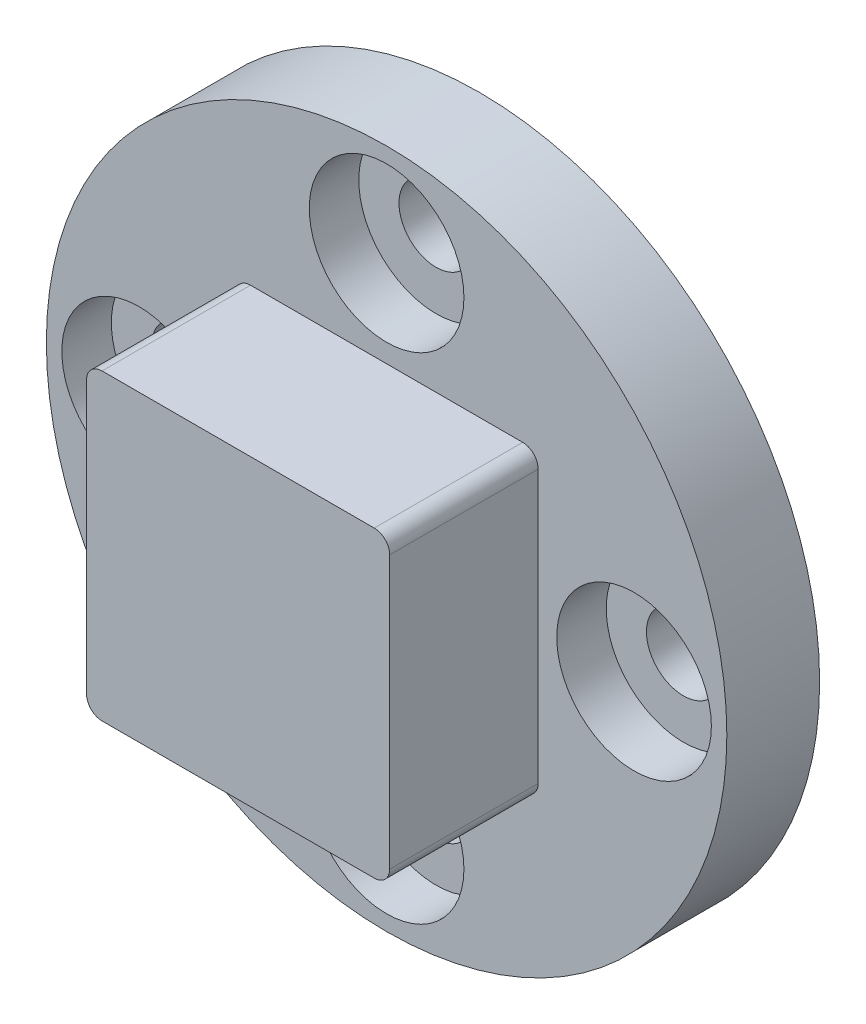
ISO-10303-21;
HEADER;
FILE_DESCRIPTION(('STEP AP214'),'2;1');
FILE_NAME('part.step','',(''),(''),'','','');
FILE_SCHEMA(('AUTOMOTIVE_DESIGN { 1 0 10303 214 1 1 1 1 }'));
ENDSEC;
DATA;
#1=APPLICATION_CONTEXT('core data for automotive mechanical design processes');
#2=APPLICATION_PROTOCOL_DEFINITION('international standard','automotive_design',2000,#1);
#3=PRODUCT_CONTEXT('',#1,'mechanical');
#4=PRODUCT('Part','Part','',(#3));
#5=PRODUCT_RELATED_PRODUCT_CATEGORY('part','',(#4));
#6=PRODUCT_DEFINITION_FORMATION('','',#4);
#7=PRODUCT_DEFINITION_CONTEXT('part definition',#1,'design');
#8=PRODUCT_DEFINITION('design','',#6,#7);
#9=PRODUCT_DEFINITION_SHAPE('','',#8);
#10=(LENGTH_UNIT() NAMED_UNIT(*) SI_UNIT(.MILLI.,.METRE.));
#11=(NAMED_UNIT(*) PLANE_ANGLE_UNIT() SI_UNIT($,.RADIAN.));
#12=(NAMED_UNIT(*) SI_UNIT($,.STERADIAN.) SOLID_ANGLE_UNIT());
#13=UNCERTAINTY_MEASURE_WITH_UNIT(LENGTH_MEASURE(1.E-05),#10,'distance_accuracy_value','');
#14=(GEOMETRIC_REPRESENTATION_CONTEXT(3) GLOBAL_UNCERTAINTY_ASSIGNED_CONTEXT((#13)) GLOBAL_UNIT_ASSIGNED_CONTEXT((#10,
#11,#12)) REPRESENTATION_CONTEXT('',''));
#15=CARTESIAN_POINT('',(0.,0.,0.));
#16=DIRECTION('',(0.,0.,1.));
#17=DIRECTION('',(1.,0.,0.));
#18=AXIS2_PLACEMENT_3D('',#15,#16,#17);
#19=CARTESIAN_POINT('',(0.,0.,3.));
#20=DIRECTION('',(0.,0.,1.));
#21=DIRECTION('',(1.,0.,0.));
#22=AXIS2_PLACEMENT_3D('',#19,#20,#21);
#23=PLANE('',#22);
#24=CARTESIAN_POINT('',(0.,8.,3.));
#25=DIRECTION('',(0.,0.,1.));
#26=DIRECTION('',(1.,0.,0.));
#27=AXIS2_PLACEMENT_3D('',#24,#25,#26);
#28=CIRCLE('',#27,2.5);
#29=CARTESIAN_POINT('',(2.5,8.,3.));
#30=VERTEX_POINT('',#29);
#31=EDGE_CURVE('E134',#30,#30,#28,.T.);
#32=ORIENTED_EDGE('',*,*,#31,.F.);
#33=EDGE_LOOP('',(#32));
#34=FACE_BOUND('',#33,.T.);
#35=CARTESIAN_POINT('',(8.,0.,3.));
#36=DIRECTION('',(0.,0.,1.));
#37=DIRECTION('',(1.,0.,0.));
#38=AXIS2_PLACEMENT_3D('',#35,#36,#37);
#39=CIRCLE('',#38,2.5);
#40=CARTESIAN_POINT('',(10.5,0.,3.));
#41=VERTEX_POINT('',#40);
#42=EDGE_CURVE('E147',#41,#41,#39,.T.);
#43=ORIENTED_EDGE('',*,*,#42,.F.);
#44=EDGE_LOOP('',(#43));
#45=FACE_BOUND('',#44,.T.);
#46=CARTESIAN_POINT('',(0.,-8.,3.));
#47=DIRECTION('',(0.,0.,1.));
#48=DIRECTION('',(1.,0.,0.));
#49=AXIS2_PLACEMENT_3D('',#46,#47,#48);
#50=CIRCLE('',#49,2.5);
#51=CARTESIAN_POINT('',(2.5,-8.,3.));
#52=VERTEX_POINT('',#51);
#53=EDGE_CURVE('E159',#52,#52,#50,.T.);
#54=ORIENTED_EDGE('',*,*,#53,.F.);
#55=EDGE_LOOP('',(#54));
#56=FACE_BOUND('',#55,.T.);
#57=CARTESIAN_POINT('',(-8.,0.,3.));
#58=DIRECTION('',(0.,0.,1.));
#59=DIRECTION('',(1.,0.,0.));
#60=AXIS2_PLACEMENT_3D('',#57,#58,#59);
#61=CIRCLE('',#60,2.5);
#62=CARTESIAN_POINT('',(-5.50000000000001,0.,3.));
#63=VERTEX_POINT('',#62);
#64=EDGE_CURVE('E171',#63,#63,#61,.T.);
#65=ORIENTED_EDGE('',*,*,#64,.F.);
#66=EDGE_LOOP('',(#65));
#67=FACE_BOUND('',#66,.T.);
#68=CARTESIAN_POINT('',(0.,0.,3.));
#69=DIRECTION('',(0.,0.,1.));
#70=DIRECTION('',(1.,0.,0.));
#71=AXIS2_PLACEMENT_3D('',#68,#69,#70);
#72=CIRCLE('',#71,11.);
#73=CARTESIAN_POINT('',(11.,0.,3.));
#74=VERTEX_POINT('',#73);
#75=EDGE_CURVE('E184',#74,#74,#72,.T.);
#76=ORIENTED_EDGE('',*,*,#75,.T.);
#77=EDGE_LOOP('',(#76));
#78=FACE_BOUND('',#77,.T.);
#79=DIRECTION('',(-1.,0.,0.));
#80=VECTOR('',#79,1.);
#81=CARTESIAN_POINT('',(-4.9,4.9,3.));
#82=LINE('',#81,#80);
#83=CARTESIAN_POINT('',(4.4,4.9,3.));
#84=VERTEX_POINT('',#83);
#85=CARTESIAN_POINT('',(-4.4,4.9,3.));
#86=VERTEX_POINT('',#85);
#87=EDGE_CURVE('E126',#84,#86,#82,.T.);
#88=ORIENTED_EDGE('',*,*,#87,.F.);
#89=CARTESIAN_POINT('',(4.4,4.4,3.));
#90=DIRECTION('',(0.,0.,1.));
#91=DIRECTION('',(1.,0.,0.));
#92=AXIS2_PLACEMENT_3D('',#89,#90,#91);
#93=CIRCLE('',#92,0.5);
#94=CARTESIAN_POINT('',(4.9,4.4,3.));
#95=VERTEX_POINT('',#94);
#96=EDGE_CURVE('E112',#84,#95,#93,.F.);
#97=ORIENTED_EDGE('',*,*,#96,.T.);
#98=DIRECTION('',(0.,1.,0.));
#99=VECTOR('',#98,1.);
#100=CARTESIAN_POINT('',(4.9,4.9,3.));
#101=LINE('',#100,#99);
#102=CARTESIAN_POINT('',(4.9,-4.4,3.));
#103=VERTEX_POINT('',#102);
#104=EDGE_CURVE('E130',#103,#95,#101,.T.);
#105=ORIENTED_EDGE('',*,*,#104,.F.);
#106=CARTESIAN_POINT('',(4.4,-4.4,3.));
#107=DIRECTION('',(0.,0.,1.));
#108=DIRECTION('',(1.,0.,0.));
#109=AXIS2_PLACEMENT_3D('',#106,#107,#108);
#110=CIRCLE('',#109,0.5);
#111=CARTESIAN_POINT('',(4.4,-4.9,3.));
#112=VERTEX_POINT('',#111);
#113=EDGE_CURVE('E47',#103,#112,#110,.F.);
#114=ORIENTED_EDGE('',*,*,#113,.T.);
#115=DIRECTION('',(1.,0.,0.));
#116=VECTOR('',#115,1.);
#117=CARTESIAN_POINT('',(-4.9,-4.9,3.));
#118=LINE('',#117,#116);
#119=CARTESIAN_POINT('',(-4.4,-4.9,3.));
#120=VERTEX_POINT('',#119);
#121=EDGE_CURVE('E125',#120,#112,#118,.T.);
#122=ORIENTED_EDGE('',*,*,#121,.F.);
#123=CARTESIAN_POINT('',(-4.4,-4.4,3.));
#124=DIRECTION('',(0.,0.,1.));
#125=DIRECTION('',(1.,0.,0.));
#126=AXIS2_PLACEMENT_3D('',#123,#124,#125);
#127=CIRCLE('',#126,0.5);
#128=CARTESIAN_POINT('',(-4.9,-4.4,3.));
#129=VERTEX_POINT('',#128);
#130=EDGE_CURVE('E11',#120,#129,#127,.F.);
#131=ORIENTED_EDGE('',*,*,#130,.T.);
#132=DIRECTION('',(0.,-1.,0.));
#133=VECTOR('',#132,1.);
#134=CARTESIAN_POINT('',(-4.9,4.9,3.));
#135=LINE('',#134,#133);
#136=CARTESIAN_POINT('',(-4.9,4.4,3.));
#137=VERTEX_POINT('',#136);
#138=EDGE_CURVE('E119',#137,#129,#135,.T.);
#139=ORIENTED_EDGE('',*,*,#138,.F.);
#140=CARTESIAN_POINT('',(-4.4,4.4,3.));
#141=DIRECTION('',(0.,0.,1.));
#142=DIRECTION('',(1.,0.,0.));
#143=AXIS2_PLACEMENT_3D('',#140,#141,#142);
#144=CIRCLE('',#143,0.5);
#145=EDGE_CURVE('E103',#137,#86,#144,.F.);
#146=ORIENTED_EDGE('',*,*,#145,.T.);
#147=EDGE_LOOP('',(#88,#97,#105,#114,#122,#131,#139,#146));
#148=FACE_BOUND('',#147,.T.);
#149=ADVANCED_FACE('F39',(#34,#45,#56,#67,#78,#148),#23,.T.);
#150=CARTESIAN_POINT('',(0.,0.,3.));
#151=DIRECTION('',(0.,0.,-1.));
#152=DIRECTION('',(-1.,0.,0.));
#153=AXIS2_PLACEMENT_3D('',#150,#151,#152);
#154=CYLINDRICAL_SURFACE('',#153,11.);
#155=ORIENTED_EDGE('',*,*,#75,.F.);
#156=EDGE_LOOP('',(#155));
#157=FACE_BOUND('',#156,.T.);
#158=CARTESIAN_POINT('',(0.,0.,0.));
#159=DIRECTION('',(0.,0.,1.));
#160=DIRECTION('',(1.,0.,0.));
#161=AXIS2_PLACEMENT_3D('',#158,#159,#160);
#162=CIRCLE('',#161,11.);
#163=CARTESIAN_POINT('',(11.,0.,0.));
#164=VERTEX_POINT('',#163);
#165=EDGE_CURVE('E183',#164,#164,#162,.T.);
#166=ORIENTED_EDGE('',*,*,#165,.T.);
#167=EDGE_LOOP('',(#166));
#168=FACE_BOUND('',#167,.T.);
#169=ADVANCED_FACE('F245',(#157,#168),#154,.T.);
#170=CARTESIAN_POINT('',(0.,0.,0.));
#171=DIRECTION('',(0.,0.,1.));
#172=DIRECTION('',(1.,0.,0.));
#173=AXIS2_PLACEMENT_3D('',#170,#171,#172);
#174=PLANE('',#173);
#175=CARTESIAN_POINT('',(0.,8.,0.));
#176=DIRECTION('',(0.,0.,1.));
#177=DIRECTION('',(1.,0.,0.));
#178=AXIS2_PLACEMENT_3D('',#175,#176,#177);
#179=CIRCLE('',#178,1.2);
#180=CARTESIAN_POINT('',(1.2,8.,0.));
#181=VERTEX_POINT('',#180);
#182=EDGE_CURVE('E144',#181,#181,#179,.T.);
#183=ORIENTED_EDGE('',*,*,#182,.T.);
#184=EDGE_LOOP('',(#183));
#185=FACE_BOUND('',#184,.T.);
#186=CARTESIAN_POINT('',(8.,0.,0.));
#187=DIRECTION('',(0.,0.,1.));
#188=DIRECTION('',(1.,0.,0.));
#189=AXIS2_PLACEMENT_3D('',#186,#187,#188);
#190=CIRCLE('',#189,1.2);
#191=CARTESIAN_POINT('',(9.2,0.,0.));
#192=VERTEX_POINT('',#191);
#193=EDGE_CURVE('E156',#192,#192,#190,.T.);
#194=ORIENTED_EDGE('',*,*,#193,.T.);
#195=EDGE_LOOP('',(#194));
#196=FACE_BOUND('',#195,.T.);
#197=CARTESIAN_POINT('',(0.,-8.,0.));
#198=DIRECTION('',(0.,0.,1.));
#199=DIRECTION('',(1.,0.,0.));
#200=AXIS2_PLACEMENT_3D('',#197,#198,#199);
#201=CIRCLE('',#200,1.2);
#202=CARTESIAN_POINT('',(1.2,-8.,0.));
#203=VERTEX_POINT('',#202);
#204=EDGE_CURVE('E168',#203,#203,#201,.T.);
#205=ORIENTED_EDGE('',*,*,#204,.T.);
#206=EDGE_LOOP('',(#205));
#207=FACE_BOUND('',#206,.T.);
#208=CARTESIAN_POINT('',(-8.,0.,0.));
#209=DIRECTION('',(0.,0.,1.));
#210=DIRECTION('',(1.,0.,0.));
#211=AXIS2_PLACEMENT_3D('',#208,#209,#210);
#212=CIRCLE('',#211,1.2);
#213=CARTESIAN_POINT('',(-6.8,0.,0.));
#214=VERTEX_POINT('',#213);
#215=EDGE_CURVE('E180',#214,#214,#212,.T.);
#216=ORIENTED_EDGE('',*,*,#215,.T.);
#217=EDGE_LOOP('',(#216));
#218=FACE_BOUND('',#217,.T.);
#219=ORIENTED_EDGE('',*,*,#165,.F.);
#220=EDGE_LOOP('',(#219));
#221=FACE_BOUND('',#220,.T.);
#222=ADVANCED_FACE('F253',(#185,#196,#207,#218,#221),#174,.F.);
#223=CARTESIAN_POINT('',(-8.,0.,3.));
#224=DIRECTION('',(0.,0.,1.));
#225=DIRECTION('',(1.,0.,0.));
#226=AXIS2_PLACEMENT_3D('',#223,#224,#225);
#227=CYLINDRICAL_SURFACE('',#226,1.2);
#228=ORIENTED_EDGE('',*,*,#215,.F.);
#229=EDGE_LOOP('',(#228));
#230=FACE_BOUND('',#229,.T.);
#231=CARTESIAN_POINT('',(-8.,0.,1.4));
#232=DIRECTION('',(0.,0.,1.));
#233=DIRECTION('',(1.,0.,0.));
#234=AXIS2_PLACEMENT_3D('',#231,#232,#233);
#235=CIRCLE('',#234,1.2);
#236=CARTESIAN_POINT('',(-6.8,0.,1.4));
#237=VERTEX_POINT('',#236);
#238=EDGE_CURVE('E177',#237,#237,#235,.T.);
#239=ORIENTED_EDGE('',*,*,#238,.T.);
#240=EDGE_LOOP('',(#239));
#241=FACE_BOUND('',#240,.T.);
#242=ADVANCED_FACE('F260',(#230,#241),#227,.F.);
#243=CARTESIAN_POINT('',(-6.8,0.,1.4));
#244=DIRECTION('',(0.,0.,-1.));
#245=DIRECTION('',(-1.,0.,0.));
#246=AXIS2_PLACEMENT_3D('',#243,#244,#245);
#247=PLANE('',#246);
#248=ORIENTED_EDGE('',*,*,#238,.F.);
#249=EDGE_LOOP('',(#248));
#250=FACE_BOUND('',#249,.T.);
#251=CARTESIAN_POINT('',(-8.,0.,1.4));
#252=DIRECTION('',(0.,0.,1.));
#253=DIRECTION('',(1.,0.,0.));
#254=AXIS2_PLACEMENT_3D('',#251,#252,#253);
#255=CIRCLE('',#254,2.5);
#256=CARTESIAN_POINT('',(-5.5,0.,1.4));
#257=VERTEX_POINT('',#256);
#258=EDGE_CURVE('E174',#257,#257,#255,.T.);
#259=ORIENTED_EDGE('',*,*,#258,.T.);
#260=EDGE_LOOP('',(#259));
#261=FACE_BOUND('',#260,.T.);
#262=ADVANCED_FACE('F414',(#250,#261),#247,.F.);
#263=CARTESIAN_POINT('',(-8.,0.,3.));
#264=DIRECTION('',(0.,0.,1.));
#265=DIRECTION('',(1.,0.,0.));
#266=AXIS2_PLACEMENT_3D('',#263,#264,#265);
#267=CYLINDRICAL_SURFACE('',#266,2.5);
#268=ORIENTED_EDGE('',*,*,#258,.F.);
#269=EDGE_LOOP('',(#268));
#270=FACE_BOUND('',#269,.T.);
#271=ORIENTED_EDGE('',*,*,#64,.T.);
#272=EDGE_LOOP('',(#271));
#273=FACE_BOUND('',#272,.T.);
#274=ADVANCED_FACE('F405',(#270,#273),#267,.F.);
#275=CARTESIAN_POINT('',(0.,-8.,3.));
#276=DIRECTION('',(0.,0.,1.));
#277=DIRECTION('',(1.,0.,0.));
#278=AXIS2_PLACEMENT_3D('',#275,#276,#277);
#279=CYLINDRICAL_SURFACE('',#278,1.2);
#280=ORIENTED_EDGE('',*,*,#204,.F.);
#281=EDGE_LOOP('',(#280));
#282=FACE_BOUND('',#281,.T.);
#283=CARTESIAN_POINT('',(0.,-8.,1.4));
#284=DIRECTION('',(0.,0.,1.));
#285=DIRECTION('',(1.,0.,0.));
#286=AXIS2_PLACEMENT_3D('',#283,#284,#285);
#287=CIRCLE('',#286,1.2);
#288=CARTESIAN_POINT('',(1.2,-8.,1.4));
#289=VERTEX_POINT('',#288);
#290=EDGE_CURVE('E165',#289,#289,#287,.T.);
#291=ORIENTED_EDGE('',*,*,#290,.T.);
#292=EDGE_LOOP('',(#291));
#293=FACE_BOUND('',#292,.T.);
#294=ADVANCED_FACE('F396',(#282,#293),#279,.F.);
#295=CARTESIAN_POINT('',(1.2,-8.,1.4));
#296=DIRECTION('',(0.,0.,-1.));
#297=DIRECTION('',(-1.,0.,0.));
#298=AXIS2_PLACEMENT_3D('',#295,#296,#297);
#299=PLANE('',#298);
#300=ORIENTED_EDGE('',*,*,#290,.F.);
#301=EDGE_LOOP('',(#300));
#302=FACE_BOUND('',#301,.T.);
#303=CARTESIAN_POINT('',(0.,-8.,1.4));
#304=DIRECTION('',(0.,0.,1.));
#305=DIRECTION('',(1.,0.,0.));
#306=AXIS2_PLACEMENT_3D('',#303,#304,#305);
#307=CIRCLE('',#306,2.5);
#308=CARTESIAN_POINT('',(2.5,-8.,1.4));
#309=VERTEX_POINT('',#308);
#310=EDGE_CURVE('E162',#309,#309,#307,.T.);
#311=ORIENTED_EDGE('',*,*,#310,.T.);
#312=EDGE_LOOP('',(#311));
#313=FACE_BOUND('',#312,.T.);
#314=ADVANCED_FACE('F387',(#302,#313),#299,.F.);
#315=CARTESIAN_POINT('',(0.,-8.,3.));
#316=DIRECTION('',(0.,0.,1.));
#317=DIRECTION('',(1.,0.,0.));
#318=AXIS2_PLACEMENT_3D('',#315,#316,#317);
#319=CYLINDRICAL_SURFACE('',#318,2.5);
#320=ORIENTED_EDGE('',*,*,#310,.F.);
#321=EDGE_LOOP('',(#320));
#322=FACE_BOUND('',#321,.T.);
#323=ORIENTED_EDGE('',*,*,#53,.T.);
#324=EDGE_LOOP('',(#323));
#325=FACE_BOUND('',#324,.T.);
#326=ADVANCED_FACE('F378',(#322,#325),#319,.F.);
#327=CARTESIAN_POINT('',(8.,0.,3.));
#328=DIRECTION('',(0.,0.,1.));
#329=DIRECTION('',(1.,0.,0.));
#330=AXIS2_PLACEMENT_3D('',#327,#328,#329);
#331=CYLINDRICAL_SURFACE('',#330,1.2);
#332=ORIENTED_EDGE('',*,*,#193,.F.);
#333=EDGE_LOOP('',(#332));
#334=FACE_BOUND('',#333,.T.);
#335=CARTESIAN_POINT('',(8.,0.,1.4));
#336=DIRECTION('',(0.,0.,1.));
#337=DIRECTION('',(1.,0.,0.));
#338=AXIS2_PLACEMENT_3D('',#335,#336,#337);
#339=CIRCLE('',#338,1.2);
#340=CARTESIAN_POINT('',(9.2,0.,1.4));
#341=VERTEX_POINT('',#340);
#342=EDGE_CURVE('E153',#341,#341,#339,.T.);
#343=ORIENTED_EDGE('',*,*,#342,.T.);
#344=EDGE_LOOP('',(#343));
#345=FACE_BOUND('',#344,.T.);
#346=ADVANCED_FACE('F369',(#334,#345),#331,.F.);
#347=CARTESIAN_POINT('',(9.2,0.,1.4));
#348=DIRECTION('',(0.,0.,-1.));
#349=DIRECTION('',(-1.,0.,0.));
#350=AXIS2_PLACEMENT_3D('',#347,#348,#349);
#351=PLANE('',#350);
#352=ORIENTED_EDGE('',*,*,#342,.F.);
#353=EDGE_LOOP('',(#352));
#354=FACE_BOUND('',#353,.T.);
#355=CARTESIAN_POINT('',(8.,0.,1.4));
#356=DIRECTION('',(0.,0.,1.));
#357=DIRECTION('',(1.,0.,0.));
#358=AXIS2_PLACEMENT_3D('',#355,#356,#357);
#359=CIRCLE('',#358,2.5);
#360=CARTESIAN_POINT('',(10.5,0.,1.4));
#361=VERTEX_POINT('',#360);
#362=EDGE_CURVE('E150',#361,#361,#359,.T.);
#363=ORIENTED_EDGE('',*,*,#362,.T.);
#364=EDGE_LOOP('',(#363));
#365=FACE_BOUND('',#364,.T.);
#366=ADVANCED_FACE('F360',(#354,#365),#351,.F.);
#367=CARTESIAN_POINT('',(8.,0.,3.));
#368=DIRECTION('',(0.,0.,1.));
#369=DIRECTION('',(1.,0.,0.));
#370=AXIS2_PLACEMENT_3D('',#367,#368,#369);
#371=CYLINDRICAL_SURFACE('',#370,2.5);
#372=ORIENTED_EDGE('',*,*,#362,.F.);
#373=EDGE_LOOP('',(#372));
#374=FACE_BOUND('',#373,.T.);
#375=ORIENTED_EDGE('',*,*,#42,.T.);
#376=EDGE_LOOP('',(#375));
#377=FACE_BOUND('',#376,.T.);
#378=ADVANCED_FACE('F351',(#374,#377),#371,.F.);
#379=CARTESIAN_POINT('',(0.,8.,3.));
#380=DIRECTION('',(0.,0.,1.));
#381=DIRECTION('',(1.,0.,0.));
#382=AXIS2_PLACEMENT_3D('',#379,#380,#381);
#383=CYLINDRICAL_SURFACE('',#382,1.2);
#384=ORIENTED_EDGE('',*,*,#182,.F.);
#385=EDGE_LOOP('',(#384));
#386=FACE_BOUND('',#385,.T.);
#387=CARTESIAN_POINT('',(0.,8.,1.4));
#388=DIRECTION('',(0.,0.,1.));
#389=DIRECTION('',(1.,0.,0.));
#390=AXIS2_PLACEMENT_3D('',#387,#388,#389);
#391=CIRCLE('',#390,1.2);
#392=CARTESIAN_POINT('',(1.2,8.,1.4));
#393=VERTEX_POINT('',#392);
#394=EDGE_CURVE('E141',#393,#393,#391,.T.);
#395=ORIENTED_EDGE('',*,*,#394,.T.);
#396=EDGE_LOOP('',(#395));
#397=FACE_BOUND('',#396,.T.);
#398=ADVANCED_FACE('F342',(#386,#397),#383,.F.);
#399=CARTESIAN_POINT('',(1.2,8.,1.4));
#400=DIRECTION('',(0.,0.,-1.));
#401=DIRECTION('',(-1.,0.,0.));
#402=AXIS2_PLACEMENT_3D('',#399,#400,#401);
#403=PLANE('',#402);
#404=ORIENTED_EDGE('',*,*,#394,.F.);
#405=EDGE_LOOP('',(#404));
#406=FACE_BOUND('',#405,.T.);
#407=CARTESIAN_POINT('',(0.,8.,1.4));
#408=DIRECTION('',(0.,0.,1.));
#409=DIRECTION('',(1.,0.,0.));
#410=AXIS2_PLACEMENT_3D('',#407,#408,#409);
#411=CIRCLE('',#410,2.5);
#412=CARTESIAN_POINT('',(2.5,8.,1.4));
#413=VERTEX_POINT('',#412);
#414=EDGE_CURVE('E137',#413,#413,#411,.T.);
#415=ORIENTED_EDGE('',*,*,#414,.T.);
#416=EDGE_LOOP('',(#415));
#417=FACE_BOUND('',#416,.T.);
#418=ADVANCED_FACE('F333',(#406,#417),#403,.F.);
#419=CARTESIAN_POINT('',(0.,8.,3.));
#420=DIRECTION('',(0.,0.,1.));
#421=DIRECTION('',(1.,0.,0.));
#422=AXIS2_PLACEMENT_3D('',#419,#420,#421);
#423=CYLINDRICAL_SURFACE('',#422,2.5);
#424=ORIENTED_EDGE('',*,*,#414,.F.);
#425=EDGE_LOOP('',(#424));
#426=FACE_BOUND('',#425,.T.);
#427=ORIENTED_EDGE('',*,*,#31,.T.);
#428=EDGE_LOOP('',(#427));
#429=FACE_BOUND('',#428,.T.);
#430=ADVANCED_FACE('F321',(#426,#429),#423,.F.);
#431=CARTESIAN_POINT('',(4.9,4.9,7.8));
#432=DIRECTION('',(-1.,0.,0.));
#433=DIRECTION('',(0.,-1.,0.));
#434=AXIS2_PLACEMENT_3D('',#431,#432,#433);
#435=PLANE('',#434);
#436=ORIENTED_EDGE('',*,*,#104,.T.);
#437=DIRECTION('',(0.,0.,-1.));
#438=VECTOR('',#437,1.);
#439=CARTESIAN_POINT('',(4.9,4.4,7.8));
#440=LINE('',#439,#438);
#441=CARTESIAN_POINT('',(4.9,4.4,7.8));
#442=VERTEX_POINT('',#441);
#443=EDGE_CURVE('E204',#95,#442,#440,.F.);
#444=ORIENTED_EDGE('',*,*,#443,.T.);
#445=DIRECTION('',(0.,1.,0.));
#446=VECTOR('',#445,1.);
#447=CARTESIAN_POINT('',(4.9,4.9,7.8));
#448=LINE('',#447,#446);
#449=CARTESIAN_POINT('',(4.9,-4.4,7.8));
#450=VERTEX_POINT('',#449);
#451=EDGE_CURVE('E128',#450,#442,#448,.T.);
#452=ORIENTED_EDGE('',*,*,#451,.F.);
#453=DIRECTION('',(0.,0.,-1.));
#454=VECTOR('',#453,1.);
#455=CARTESIAN_POINT('',(4.9,-4.4,7.8));
#456=LINE('',#455,#454);
#457=EDGE_CURVE('E201',#450,#103,#456,.T.);
#458=ORIENTED_EDGE('',*,*,#457,.T.);
#459=EDGE_LOOP('',(#436,#444,#452,#458));
#460=FACE_BOUND('',#459,.T.);
#461=ADVANCED_FACE('F214',(#460),#435,.F.);
#462=CARTESIAN_POINT('',(-4.9,4.9,7.8));
#463=DIRECTION('',(0.,-1.,0.));
#464=DIRECTION('',(0.,0.,-1.));
#465=AXIS2_PLACEMENT_3D('',#462,#463,#464);
#466=PLANE('',#465);
#467=ORIENTED_EDGE('',*,*,#87,.T.);
#468=DIRECTION('',(0.,0.,-1.));
#469=VECTOR('',#468,1.);
#470=CARTESIAN_POINT('',(-4.4,4.9,7.8));
#471=LINE('',#470,#469);
#472=CARTESIAN_POINT('',(-4.4,4.9,7.8));
#473=VERTEX_POINT('',#472);
#474=EDGE_CURVE('E108',#86,#473,#471,.F.);
#475=ORIENTED_EDGE('',*,*,#474,.T.);
#476=DIRECTION('',(-1.,0.,0.));
#477=VECTOR('',#476,1.);
#478=CARTESIAN_POINT('',(-4.9,4.9,7.8));
#479=LINE('',#478,#477);
#480=CARTESIAN_POINT('',(4.4,4.9,7.8));
#481=VERTEX_POINT('',#480);
#482=EDGE_CURVE('E224',#481,#473,#479,.T.);
#483=ORIENTED_EDGE('',*,*,#482,.F.);
#484=DIRECTION('',(0.,0.,-1.));
#485=VECTOR('',#484,1.);
#486=CARTESIAN_POINT('',(4.4,4.9,7.8));
#487=LINE('',#486,#485);
#488=EDGE_CURVE('E122',#481,#84,#487,.T.);
#489=ORIENTED_EDGE('',*,*,#488,.T.);
#490=EDGE_LOOP('',(#467,#475,#483,#489));
#491=FACE_BOUND('',#490,.T.);
#492=ADVANCED_FACE('F226',(#491),#466,.F.);
#493=CARTESIAN_POINT('',(-4.9,4.9,7.8));
#494=DIRECTION('',(1.,0.,0.));
#495=DIRECTION('',(0.,1.,0.));
#496=AXIS2_PLACEMENT_3D('',#493,#494,#495);
#497=PLANE('',#496);
#498=DIRECTION('',(0.,-1.,0.));
#499=VECTOR('',#498,1.);
#500=CARTESIAN_POINT('',(-4.9,4.9,7.8));
#501=LINE('',#500,#499);
#502=CARTESIAN_POINT('',(-4.9,4.4,7.8));
#503=VERTEX_POINT('',#502);
#504=CARTESIAN_POINT('',(-4.9,-4.4,7.8));
#505=VERTEX_POINT('',#504);
#506=EDGE_CURVE('E121',#503,#505,#501,.T.);
#507=ORIENTED_EDGE('',*,*,#506,.F.);
#508=DIRECTION('',(0.,0.,-1.));
#509=VECTOR('',#508,1.);
#510=CARTESIAN_POINT('',(-4.9,4.4,7.8));
#511=LINE('',#510,#509);
#512=EDGE_CURVE('E107',#503,#137,#511,.T.);
#513=ORIENTED_EDGE('',*,*,#512,.T.);
#514=ORIENTED_EDGE('',*,*,#138,.T.);
#515=DIRECTION('',(0.,0.,-1.));
#516=VECTOR('',#515,1.);
#517=CARTESIAN_POINT('',(-4.9,-4.4,7.8));
#518=LINE('',#517,#516);
#519=EDGE_CURVE('E123',#129,#505,#518,.F.);
#520=ORIENTED_EDGE('',*,*,#519,.T.);
#521=EDGE_LOOP('',(#507,#513,#514,#520));
#522=FACE_BOUND('',#521,.T.);
#523=ADVANCED_FACE('F118',(#522),#497,.F.);
#524=CARTESIAN_POINT('',(-4.9,-4.9,7.8));
#525=DIRECTION('',(0.,1.,0.));
#526=DIRECTION('',(0.,0.,1.));
#527=AXIS2_PLACEMENT_3D('',#524,#525,#526);
#528=PLANE('',#527);
#529=ORIENTED_EDGE('',*,*,#121,.T.);
#530=DIRECTION('',(0.,0.,-1.));
#531=VECTOR('',#530,1.);
#532=CARTESIAN_POINT('',(4.4,-4.9,7.8));
#533=LINE('',#532,#531);
#534=CARTESIAN_POINT('',(4.4,-4.9,7.8));
#535=VERTEX_POINT('',#534);
#536=EDGE_CURVE('E113',#112,#535,#533,.F.);
#537=ORIENTED_EDGE('',*,*,#536,.T.);
#538=DIRECTION('',(1.,0.,0.));
#539=VECTOR('',#538,1.);
#540=CARTESIAN_POINT('',(-4.9,-4.9,7.8));
#541=LINE('',#540,#539);
#542=CARTESIAN_POINT('',(-4.4,-4.9,7.8));
#543=VERTEX_POINT('',#542);
#544=EDGE_CURVE('E138',#543,#535,#541,.T.);
#545=ORIENTED_EDGE('',*,*,#544,.F.);
#546=DIRECTION('',(0.,0.,-1.));
#547=VECTOR('',#546,1.);
#548=CARTESIAN_POINT('',(-4.4,-4.9,7.8));
#549=LINE('',#548,#547);
#550=EDGE_CURVE('E206',#543,#120,#549,.T.);
#551=ORIENTED_EDGE('',*,*,#550,.T.);
#552=EDGE_LOOP('',(#529,#537,#545,#551));
#553=FACE_BOUND('',#552,.T.);
#554=ADVANCED_FACE('F239',(#553),#528,.F.);
#555=CARTESIAN_POINT('',(0.,0.,7.8));
#556=DIRECTION('',(0.,0.,1.));
#557=DIRECTION('',(1.,0.,0.));
#558=AXIS2_PLACEMENT_3D('',#555,#556,#557);
#559=PLANE('',#558);
#560=ORIENTED_EDGE('',*,*,#482,.T.);
#561=CARTESIAN_POINT('',(-4.4,4.4,7.8));
#562=DIRECTION('',(0.,0.,1.));
#563=DIRECTION('',(1.,0.,0.));
#564=AXIS2_PLACEMENT_3D('',#561,#562,#563);
#565=CIRCLE('',#564,0.5);
#566=EDGE_CURVE('E199',#473,#503,#565,.T.);
#567=ORIENTED_EDGE('',*,*,#566,.T.);
#568=ORIENTED_EDGE('',*,*,#506,.T.);
#569=CARTESIAN_POINT('',(-4.4,-4.4,7.8));
#570=DIRECTION('',(0.,0.,1.));
#571=DIRECTION('',(1.,0.,0.));
#572=AXIS2_PLACEMENT_3D('',#569,#570,#571);
#573=CIRCLE('',#572,0.5);
#574=EDGE_CURVE('E193',#505,#543,#573,.T.);
#575=ORIENTED_EDGE('',*,*,#574,.T.);
#576=ORIENTED_EDGE('',*,*,#544,.T.);
#577=CARTESIAN_POINT('',(4.4,-4.4,7.8));
#578=DIRECTION('',(0.,0.,1.));
#579=DIRECTION('',(1.,0.,0.));
#580=AXIS2_PLACEMENT_3D('',#577,#578,#579);
#581=CIRCLE('',#580,0.5);
#582=EDGE_CURVE('E195',#535,#450,#581,.T.);
#583=ORIENTED_EDGE('',*,*,#582,.T.);
#584=ORIENTED_EDGE('',*,*,#451,.T.);
#585=CARTESIAN_POINT('',(4.4,4.4,7.8));
#586=DIRECTION('',(0.,0.,1.));
#587=DIRECTION('',(1.,0.,0.));
#588=AXIS2_PLACEMENT_3D('',#585,#586,#587);
#589=CIRCLE('',#588,0.5);
#590=EDGE_CURVE('E197',#442,#481,#589,.T.);
#591=ORIENTED_EDGE('',*,*,#590,.T.);
#592=EDGE_LOOP('',(#560,#567,#568,#575,#576,#583,#584,#591));
#593=FACE_BOUND('',#592,.T.);
#594=ADVANCED_FACE('F223',(#593),#559,.T.);
#595=CARTESIAN_POINT('',(-4.4,4.4,7.8));
#596=DIRECTION('',(0.,0.,-1.));
#597=DIRECTION('',(-1.,0.,0.));
#598=AXIS2_PLACEMENT_3D('',#595,#596,#597);
#599=CYLINDRICAL_SURFACE('',#598,0.5);
#600=ORIENTED_EDGE('',*,*,#566,.F.);
#601=ORIENTED_EDGE('',*,*,#474,.F.);
#602=ORIENTED_EDGE('',*,*,#145,.F.);
#603=ORIENTED_EDGE('',*,*,#512,.F.);
#604=EDGE_LOOP('',(#600,#601,#602,#603));
#605=FACE_BOUND('',#604,.T.);
#606=ADVANCED_FACE('F106',(#605),#599,.T.);
#607=CARTESIAN_POINT('',(4.4,4.4,7.8));
#608=DIRECTION('',(0.,0.,-1.));
#609=DIRECTION('',(-1.,0.,0.));
#610=AXIS2_PLACEMENT_3D('',#607,#608,#609);
#611=CYLINDRICAL_SURFACE('',#610,0.5);
#612=ORIENTED_EDGE('',*,*,#590,.F.);
#613=ORIENTED_EDGE('',*,*,#443,.F.);
#614=ORIENTED_EDGE('',*,*,#96,.F.);
#615=ORIENTED_EDGE('',*,*,#488,.F.);
#616=EDGE_LOOP('',(#612,#613,#614,#615));
#617=FACE_BOUND('',#616,.T.);
#618=ADVANCED_FACE('F219',(#617),#611,.T.);
#619=CARTESIAN_POINT('',(4.4,-4.4,7.8));
#620=DIRECTION('',(0.,0.,-1.));
#621=DIRECTION('',(-1.,0.,0.));
#622=AXIS2_PLACEMENT_3D('',#619,#620,#621);
#623=CYLINDRICAL_SURFACE('',#622,0.5);
#624=ORIENTED_EDGE('',*,*,#582,.F.);
#625=ORIENTED_EDGE('',*,*,#536,.F.);
#626=ORIENTED_EDGE('',*,*,#113,.F.);
#627=ORIENTED_EDGE('',*,*,#457,.F.);
#628=EDGE_LOOP('',(#624,#625,#626,#627));
#629=FACE_BOUND('',#628,.T.);
#630=ADVANCED_FACE('F238',(#629),#623,.T.);
#631=CARTESIAN_POINT('',(-4.4,-4.4,7.8));
#632=DIRECTION('',(0.,0.,-1.));
#633=DIRECTION('',(-1.,0.,0.));
#634=AXIS2_PLACEMENT_3D('',#631,#632,#633);
#635=CYLINDRICAL_SURFACE('',#634,0.5);
#636=ORIENTED_EDGE('',*,*,#574,.F.);
#637=ORIENTED_EDGE('',*,*,#519,.F.);
#638=ORIENTED_EDGE('',*,*,#130,.F.);
#639=ORIENTED_EDGE('',*,*,#550,.F.);
#640=EDGE_LOOP('',(#636,#637,#638,#639));
#641=FACE_BOUND('',#640,.T.);
#642=ADVANCED_FACE('F41',(#641),#635,.T.);
#643=CLOSED_SHELL('',(#149,#169,#222,#242,#262,#274,#294,#314,#326,#346,#366,#378,#398,#418,
#430,#461,#492,#523,#554,#594,#606,#618,#630,#642));
#644=MANIFOLD_SOLID_BREP('B2',#643);
#645=ADVANCED_BREP_SHAPE_REPRESENTATION('',(#18,#644),#14);
#646=SHAPE_DEFINITION_REPRESENTATION(#9,#645);
ENDSEC;
END-ISO-10303-21;
